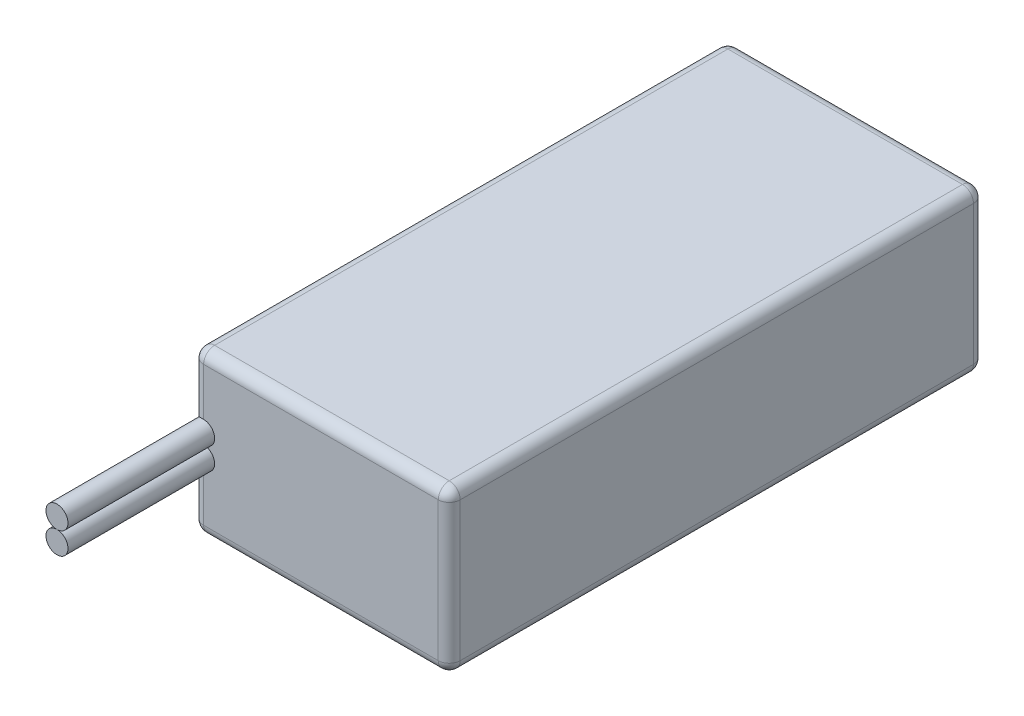
ISO-10303-21;
HEADER;
FILE_DESCRIPTION(('STEP AP214'),'2;1');
FILE_NAME('part.step','',(''),(''),'','','');
FILE_SCHEMA(('AUTOMOTIVE_DESIGN { 1 0 10303 214 1 1 1 1 }'));
ENDSEC;
DATA;
#1=APPLICATION_CONTEXT('core data for automotive mechanical design processes');
#2=APPLICATION_PROTOCOL_DEFINITION('international standard','automotive_design',2000,#1);
#3=PRODUCT_CONTEXT('',#1,'mechanical');
#4=PRODUCT('Part','Part','',(#3));
#5=PRODUCT_RELATED_PRODUCT_CATEGORY('part','',(#4));
#6=PRODUCT_DEFINITION_FORMATION('','',#4);
#7=PRODUCT_DEFINITION_CONTEXT('part definition',#1,'design');
#8=PRODUCT_DEFINITION('design','',#6,#7);
#9=PRODUCT_DEFINITION_SHAPE('','',#8);
#10=(LENGTH_UNIT() NAMED_UNIT(*) SI_UNIT(.MILLI.,.METRE.));
#11=(NAMED_UNIT(*) PLANE_ANGLE_UNIT() SI_UNIT($,.RADIAN.));
#12=(NAMED_UNIT(*) SI_UNIT($,.STERADIAN.) SOLID_ANGLE_UNIT());
#13=UNCERTAINTY_MEASURE_WITH_UNIT(LENGTH_MEASURE(1.E-05),#10,'distance_accuracy_value','');
#14=(GEOMETRIC_REPRESENTATION_CONTEXT(3) GLOBAL_UNCERTAINTY_ASSIGNED_CONTEXT((#13)) GLOBAL_UNIT_ASSIGNED_CONTEXT((#10,
#11,#12)) REPRESENTATION_CONTEXT('',''));
#15=CARTESIAN_POINT('',(0.,0.,0.));
#16=DIRECTION('',(0.,0.,1.));
#17=DIRECTION('',(1.,0.,0.));
#18=AXIS2_PLACEMENT_3D('',#15,#16,#17);
#19=CARTESIAN_POINT('',(-16.,9.5,31.5));
#20=DIRECTION('',(0.,0.,1.));
#21=DIRECTION('',(1.,0.,0.));
#22=AXIS2_PLACEMENT_3D('',#19,#20,#21);
#23=CYLINDRICAL_SURFACE('',#22,1.5);
#24=CARTESIAN_POINT('',(-16.,9.5,31.5));
#25=DIRECTION('',(0.,0.,1.));
#26=DIRECTION('',(1.,0.,0.));
#27=AXIS2_PLACEMENT_3D('',#24,#25,#26);
#28=CIRCLE('',#27,1.5);
#29=CARTESIAN_POINT('',(-14.5,9.5,31.5));
#30=VERTEX_POINT('',#29);
#31=EDGE_CURVE('E12',#30,#30,#28,.F.);
#32=ORIENTED_EDGE('',*,*,#31,.F.);
#33=EDGE_LOOP('',(#32));
#34=FACE_BOUND('',#33,.T.);
#35=CARTESIAN_POINT('',(-16.,9.5,56.5));
#36=DIRECTION('',(0.,0.,1.));
#37=DIRECTION('',(1.,0.,0.));
#38=AXIS2_PLACEMENT_3D('',#35,#36,#37);
#39=CIRCLE('',#38,1.5);
#40=CARTESIAN_POINT('',(-14.5,9.5,56.5));
#41=VERTEX_POINT('',#40);
#42=EDGE_CURVE('E72',#41,#41,#39,.F.);
#43=ORIENTED_EDGE('',*,*,#42,.T.);
#44=EDGE_LOOP('',(#43));
#45=FACE_BOUND('',#44,.T.);
#46=ADVANCED_FACE('F66',(#34,#45),#23,.T.);
#47=CARTESIAN_POINT('',(0.,0.,31.5));
#48=DIRECTION('',(0.,0.,1.));
#49=DIRECTION('',(1.,0.,0.));
#50=AXIS2_PLACEMENT_3D('',#47,#48,#49);
#51=PLANE('',#50);
#52=ORIENTED_EDGE('',*,*,#31,.T.);
#53=EDGE_LOOP('',(#52));
#54=FACE_BOUND('',#53,.T.);
#55=ADVANCED_FACE('F81',(#54),#51,.F.);
#56=CARTESIAN_POINT('',(0.,0.,56.5));
#57=DIRECTION('',(0.,0.,1.));
#58=DIRECTION('',(1.,0.,0.));
#59=AXIS2_PLACEMENT_3D('',#56,#57,#58);
#60=PLANE('',#59);
#61=ORIENTED_EDGE('',*,*,#42,.F.);
#62=EDGE_LOOP('',(#61));
#63=FACE_BOUND('',#62,.T.);
#64=ADVANCED_FACE('F79',(#63),#60,.T.);
#65=CLOSED_SHELL('',(#46,#55,#64));
#66=MANIFOLD_SOLID_BREP('B2',#65);
#67=CARTESIAN_POINT('',(-16.,12.5,31.5));
#68=DIRECTION('',(0.,0.,1.));
#69=DIRECTION('',(1.,0.,0.));
#70=AXIS2_PLACEMENT_3D('',#67,#68,#69);
#71=CYLINDRICAL_SURFACE('',#70,1.5);
#72=CARTESIAN_POINT('',(-16.,12.5,31.5));
#73=DIRECTION('',(0.,0.,1.));
#74=DIRECTION('',(1.,0.,0.));
#75=AXIS2_PLACEMENT_3D('',#72,#73,#74);
#76=CIRCLE('',#75,1.5);
#77=CARTESIAN_POINT('',(-14.5,12.5,31.5));
#78=VERTEX_POINT('',#77);
#79=EDGE_CURVE('E65',#78,#78,#76,.T.);
#80=ORIENTED_EDGE('',*,*,#79,.T.);
#81=EDGE_LOOP('',(#80));
#82=FACE_BOUND('',#81,.T.);
#83=CARTESIAN_POINT('',(-16.,12.5,56.5));
#84=DIRECTION('',(0.,0.,1.));
#85=DIRECTION('',(1.,0.,0.));
#86=AXIS2_PLACEMENT_3D('',#83,#84,#85);
#87=CIRCLE('',#86,1.5);
#88=CARTESIAN_POINT('',(-14.5,12.5,56.5));
#89=VERTEX_POINT('',#88);
#90=EDGE_CURVE('E128',#89,#89,#87,.T.);
#91=ORIENTED_EDGE('',*,*,#90,.F.);
#92=EDGE_LOOP('',(#91));
#93=FACE_BOUND('',#92,.T.);
#94=ADVANCED_FACE('F122',(#82,#93),#71,.T.);
#95=CARTESIAN_POINT('',(0.,0.,31.5));
#96=DIRECTION('',(0.,0.,1.));
#97=DIRECTION('',(1.,0.,0.));
#98=AXIS2_PLACEMENT_3D('',#95,#96,#97);
#99=PLANE('',#98);
#100=ORIENTED_EDGE('',*,*,#79,.F.);
#101=EDGE_LOOP('',(#100));
#102=FACE_BOUND('',#101,.T.);
#103=ADVANCED_FACE('F137',(#102),#99,.F.);
#104=CARTESIAN_POINT('',(0.,0.,56.5));
#105=DIRECTION('',(0.,0.,1.));
#106=DIRECTION('',(1.,0.,0.));
#107=AXIS2_PLACEMENT_3D('',#104,#105,#106);
#108=PLANE('',#107);
#109=ORIENTED_EDGE('',*,*,#90,.T.);
#110=EDGE_LOOP('',(#109));
#111=FACE_BOUND('',#110,.T.);
#112=ADVANCED_FACE('F134',(#111),#108,.T.);
#113=CLOSED_SHELL('',(#94,#103,#112));
#114=MANIFOLD_SOLID_BREP('B7',#113);
#115=CARTESIAN_POINT('',(17.5,22.,36.5));
#116=DIRECTION('',(-1.,0.,0.));
#117=DIRECTION('',(0.,0.,1.));
#118=AXIS2_PLACEMENT_3D('',#115,#116,#117);
#119=PLANE('',#118);
#120=DIRECTION('',(0.,-1.,0.));
#121=VECTOR('',#120,1.);
#122=CARTESIAN_POINT('',(17.5,22.,-35.));
#123=LINE('',#122,#121);
#124=CARTESIAN_POINT('',(17.5,1.5,-35.));
#125=VERTEX_POINT('',#124);
#126=CARTESIAN_POINT('',(17.5,20.5,-35.));
#127=VERTEX_POINT('',#126);
#128=EDGE_CURVE('E266',#125,#127,#123,.F.);
#129=ORIENTED_EDGE('',*,*,#128,.T.);
#130=DIRECTION('',(0.,0.,-1.));
#131=VECTOR('',#130,1.);
#132=CARTESIAN_POINT('',(17.5,20.5,36.5));
#133=LINE('',#132,#131);
#134=CARTESIAN_POINT('',(17.5,20.5,35.));
#135=VERTEX_POINT('',#134);
#136=EDGE_CURVE('E312',#127,#135,#133,.F.);
#137=ORIENTED_EDGE('',*,*,#136,.T.);
#138=DIRECTION('',(0.,-1.,0.));
#139=VECTOR('',#138,1.);
#140=CARTESIAN_POINT('',(17.5,22.,35.));
#141=LINE('',#140,#139);
#142=CARTESIAN_POINT('',(17.5,1.5,35.));
#143=VERTEX_POINT('',#142);
#144=EDGE_CURVE('E307',#135,#143,#141,.T.);
#145=ORIENTED_EDGE('',*,*,#144,.T.);
#146=DIRECTION('',(0.,0.,-1.));
#147=VECTOR('',#146,1.);
#148=CARTESIAN_POINT('',(17.5,1.5,-36.5));
#149=LINE('',#148,#147);
#150=EDGE_CURVE('E301',#143,#125,#149,.T.);
#151=ORIENTED_EDGE('',*,*,#150,.T.);
#152=EDGE_LOOP('',(#129,#137,#145,#151));
#153=FACE_BOUND('',#152,.T.);
#154=ADVANCED_FACE('F169',(#153),#119,.F.);
#155=CARTESIAN_POINT('',(-17.5,22.,-36.5));
#156=DIRECTION('',(0.,0.,1.));
#157=DIRECTION('',(1.,0.,0.));
#158=AXIS2_PLACEMENT_3D('',#155,#156,#157);
#159=PLANE('',#158);
#160=DIRECTION('',(0.,-1.,0.));
#161=VECTOR('',#160,1.);
#162=CARTESIAN_POINT('',(-16.,22.,-36.5));
#163=LINE('',#162,#161);
#164=CARTESIAN_POINT('',(-16.,1.5,-36.5));
#165=VERTEX_POINT('',#164);
#166=CARTESIAN_POINT('',(-16.,20.5,-36.5));
#167=VERTEX_POINT('',#166);
#168=EDGE_CURVE('E291',#165,#167,#163,.F.);
#169=ORIENTED_EDGE('',*,*,#168,.T.);
#170=DIRECTION('',(-1.,0.,0.));
#171=VECTOR('',#170,1.);
#172=CARTESIAN_POINT('',(-17.5,20.5,-36.5));
#173=LINE('',#172,#171);
#174=CARTESIAN_POINT('',(16.,20.5,-36.5));
#175=VERTEX_POINT('',#174);
#176=EDGE_CURVE('E295',#167,#175,#173,.F.);
#177=ORIENTED_EDGE('',*,*,#176,.T.);
#178=DIRECTION('',(0.,-1.,0.));
#179=VECTOR('',#178,1.);
#180=CARTESIAN_POINT('',(16.,22.,-36.5));
#181=LINE('',#180,#179);
#182=CARTESIAN_POINT('',(16.,1.5,-36.5));
#183=VERTEX_POINT('',#182);
#184=EDGE_CURVE('E264',#175,#183,#181,.T.);
#185=ORIENTED_EDGE('',*,*,#184,.T.);
#186=DIRECTION('',(-1.,0.,0.));
#187=VECTOR('',#186,1.);
#188=CARTESIAN_POINT('',(-17.5,1.5,-36.5));
#189=LINE('',#188,#187);
#190=EDGE_CURVE('E284',#183,#165,#189,.T.);
#191=ORIENTED_EDGE('',*,*,#190,.T.);
#192=EDGE_LOOP('',(#169,#177,#185,#191));
#193=FACE_BOUND('',#192,.T.);
#194=ADVANCED_FACE('F293',(#193),#159,.F.);
#195=CARTESIAN_POINT('',(-17.5,22.,36.5));
#196=DIRECTION('',(1.,0.,0.));
#197=DIRECTION('',(0.,0.,-1.));
#198=AXIS2_PLACEMENT_3D('',#195,#196,#197);
#199=PLANE('',#198);
#200=DIRECTION('',(0.,-1.,0.));
#201=VECTOR('',#200,1.);
#202=CARTESIAN_POINT('',(-17.5,22.,35.));
#203=LINE('',#202,#201);
#204=CARTESIAN_POINT('',(-17.5,1.5,35.));
#205=VERTEX_POINT('',#204);
#206=CARTESIAN_POINT('',(-17.5,20.5,35.));
#207=VERTEX_POINT('',#206);
#208=EDGE_CURVE('E318',#205,#207,#203,.F.);
#209=ORIENTED_EDGE('',*,*,#208,.T.);
#210=DIRECTION('',(0.,0.,1.));
#211=VECTOR('',#210,1.);
#212=CARTESIAN_POINT('',(-17.5,20.5,36.5));
#213=LINE('',#212,#211);
#214=CARTESIAN_POINT('',(-17.5,20.5,-35.));
#215=VERTEX_POINT('',#214);
#216=EDGE_CURVE('E325',#207,#215,#213,.F.);
#217=ORIENTED_EDGE('',*,*,#216,.T.);
#218=DIRECTION('',(0.,-1.,0.));
#219=VECTOR('',#218,1.);
#220=CARTESIAN_POINT('',(-17.5,22.,-35.));
#221=LINE('',#220,#219);
#222=CARTESIAN_POINT('',(-17.5,1.5,-35.));
#223=VERTEX_POINT('',#222);
#224=EDGE_CURVE('E321',#215,#223,#221,.T.);
#225=ORIENTED_EDGE('',*,*,#224,.T.);
#226=DIRECTION('',(0.,0.,1.));
#227=VECTOR('',#226,1.);
#228=CARTESIAN_POINT('',(-17.5,1.5,36.5));
#229=LINE('',#228,#227);
#230=EDGE_CURVE('E315',#223,#205,#229,.T.);
#231=ORIENTED_EDGE('',*,*,#230,.T.);
#232=EDGE_LOOP('',(#209,#217,#225,#231));
#233=FACE_BOUND('',#232,.T.);
#234=ADVANCED_FACE('F464',(#233),#199,.F.);
#235=CARTESIAN_POINT('',(-17.5,22.,36.5));
#236=DIRECTION('',(0.,0.,-1.));
#237=DIRECTION('',(-1.,0.,0.));
#238=AXIS2_PLACEMENT_3D('',#235,#236,#237);
#239=PLANE('',#238);
#240=DIRECTION('',(0.,-1.,0.));
#241=VECTOR('',#240,1.);
#242=CARTESIAN_POINT('',(16.,22.,36.5));
#243=LINE('',#242,#241);
#244=CARTESIAN_POINT('',(16.,1.5,36.5));
#245=VERTEX_POINT('',#244);
#246=CARTESIAN_POINT('',(16.,20.5,36.5));
#247=VERTEX_POINT('',#246);
#248=EDGE_CURVE('E331',#245,#247,#243,.F.);
#249=ORIENTED_EDGE('',*,*,#248,.T.);
#250=DIRECTION('',(1.,0.,0.));
#251=VECTOR('',#250,1.);
#252=CARTESIAN_POINT('',(-17.5,20.5,36.5));
#253=LINE('',#252,#251);
#254=CARTESIAN_POINT('',(-16.,20.5,36.5));
#255=VERTEX_POINT('',#254);
#256=EDGE_CURVE('E338',#247,#255,#253,.F.);
#257=ORIENTED_EDGE('',*,*,#256,.T.);
#258=DIRECTION('',(0.,-1.,0.));
#259=VECTOR('',#258,1.);
#260=CARTESIAN_POINT('',(-16.,22.,36.5));
#261=LINE('',#260,#259);
#262=CARTESIAN_POINT('',(-16.,1.5,36.5));
#263=VERTEX_POINT('',#262);
#264=EDGE_CURVE('E334',#255,#263,#261,.T.);
#265=ORIENTED_EDGE('',*,*,#264,.T.);
#266=DIRECTION('',(1.,0.,0.));
#267=VECTOR('',#266,1.);
#268=CARTESIAN_POINT('',(17.5,1.5,36.5));
#269=LINE('',#268,#267);
#270=EDGE_CURVE('E328',#263,#245,#269,.T.);
#271=ORIENTED_EDGE('',*,*,#270,.T.);
#272=EDGE_LOOP('',(#249,#257,#265,#271));
#273=FACE_BOUND('',#272,.T.);
#274=ADVANCED_FACE('F475',(#273),#239,.F.);
#275=CARTESIAN_POINT('',(0.,22.,0.));
#276=DIRECTION('',(0.,-1.,0.));
#277=DIRECTION('',(0.,0.,-1.));
#278=AXIS2_PLACEMENT_3D('',#275,#276,#277);
#279=PLANE('',#278);
#280=DIRECTION('',(0.,0.,1.));
#281=VECTOR('',#280,1.);
#282=CARTESIAN_POINT('',(-16.,22.,0.));
#283=LINE('',#282,#281);
#284=CARTESIAN_POINT('',(-16.,22.,-35.));
#285=VERTEX_POINT('',#284);
#286=CARTESIAN_POINT('',(-16.,22.,35.));
#287=VERTEX_POINT('',#286);
#288=EDGE_CURVE('E347',#285,#287,#283,.T.);
#289=ORIENTED_EDGE('',*,*,#288,.T.);
#290=DIRECTION('',(1.,0.,0.));
#291=VECTOR('',#290,1.);
#292=CARTESIAN_POINT('',(0.,22.,35.));
#293=LINE('',#292,#291);
#294=CARTESIAN_POINT('',(16.,22.,35.));
#295=VERTEX_POINT('',#294);
#296=EDGE_CURVE('E350',#287,#295,#293,.T.);
#297=ORIENTED_EDGE('',*,*,#296,.T.);
#298=DIRECTION('',(0.,0.,-1.));
#299=VECTOR('',#298,1.);
#300=CARTESIAN_POINT('',(16.,22.,0.));
#301=LINE('',#300,#299);
#302=CARTESIAN_POINT('',(16.,22.,-35.));
#303=VERTEX_POINT('',#302);
#304=EDGE_CURVE('E341',#295,#303,#301,.T.);
#305=ORIENTED_EDGE('',*,*,#304,.T.);
#306=DIRECTION('',(-1.,0.,0.));
#307=VECTOR('',#306,1.);
#308=CARTESIAN_POINT('',(0.,22.,-35.));
#309=LINE('',#308,#307);
#310=EDGE_CURVE('E344',#303,#285,#309,.T.);
#311=ORIENTED_EDGE('',*,*,#310,.T.);
#312=EDGE_LOOP('',(#289,#297,#305,#311));
#313=FACE_BOUND('',#312,.T.);
#314=ADVANCED_FACE('F456',(#313),#279,.F.);
#315=CARTESIAN_POINT('',(0.,0.,0.));
#316=DIRECTION('',(0.,-1.,0.));
#317=DIRECTION('',(0.,0.,-1.));
#318=AXIS2_PLACEMENT_3D('',#315,#316,#317);
#319=PLANE('',#318);
#320=DIRECTION('',(0.,0.,1.));
#321=VECTOR('',#320,1.);
#322=CARTESIAN_POINT('',(-16.,0.,-36.5));
#323=LINE('',#322,#321);
#324=CARTESIAN_POINT('',(-16.,0.,35.));
#325=VERTEX_POINT('',#324);
#326=CARTESIAN_POINT('',(-16.,0.,-35.));
#327=VERTEX_POINT('',#326);
#328=EDGE_CURVE('E179',#325,#327,#323,.F.);
#329=ORIENTED_EDGE('',*,*,#328,.T.);
#330=DIRECTION('',(-1.,0.,0.));
#331=VECTOR('',#330,1.);
#332=CARTESIAN_POINT('',(17.5,0.,-35.));
#333=LINE('',#332,#331);
#334=CARTESIAN_POINT('',(16.,0.,-35.));
#335=VERTEX_POINT('',#334);
#336=EDGE_CURVE('E120',#327,#335,#333,.F.);
#337=ORIENTED_EDGE('',*,*,#336,.T.);
#338=DIRECTION('',(0.,0.,-1.));
#339=VECTOR('',#338,1.);
#340=CARTESIAN_POINT('',(16.,0.,36.5));
#341=LINE('',#340,#339);
#342=CARTESIAN_POINT('',(16.,0.,35.));
#343=VERTEX_POINT('',#342);
#344=EDGE_CURVE('E354',#335,#343,#341,.F.);
#345=ORIENTED_EDGE('',*,*,#344,.T.);
#346=DIRECTION('',(1.,0.,0.));
#347=VECTOR('',#346,1.);
#348=CARTESIAN_POINT('',(-17.5,0.,35.));
#349=LINE('',#348,#347);
#350=EDGE_CURVE('E190',#343,#325,#349,.F.);
#351=ORIENTED_EDGE('',*,*,#350,.T.);
#352=EDGE_LOOP('',(#329,#337,#345,#351));
#353=FACE_BOUND('',#352,.T.);
#354=ADVANCED_FACE('F661',(#353),#319,.T.);
#355=CARTESIAN_POINT('',(-16.,22.,35.));
#356=DIRECTION('',(0.,-1.,0.));
#357=DIRECTION('',(0.,0.,-1.));
#358=AXIS2_PLACEMENT_3D('',#355,#356,#357);
#359=CYLINDRICAL_SURFACE('',#358,1.5);
#360=CARTESIAN_POINT('',(-16.,20.5,35.));
#361=DIRECTION('',(0.,1.,0.));
#362=DIRECTION('',(0.,0.,1.));
#363=AXIS2_PLACEMENT_3D('',#360,#361,#362);
#364=CIRCLE('',#363,1.5);
#365=EDGE_CURVE('E173',#207,#255,#364,.T.);
#366=ORIENTED_EDGE('',*,*,#365,.F.);
#367=ORIENTED_EDGE('',*,*,#208,.F.);
#368=CARTESIAN_POINT('',(-16.,1.5,35.));
#369=DIRECTION('',(0.,-1.,0.));
#370=DIRECTION('',(0.,0.,-1.));
#371=AXIS2_PLACEMENT_3D('',#368,#369,#370);
#372=CIRCLE('',#371,1.5);
#373=EDGE_CURVE('E431',#263,#205,#372,.T.);
#374=ORIENTED_EDGE('',*,*,#373,.F.);
#375=ORIENTED_EDGE('',*,*,#264,.F.);
#376=EDGE_LOOP('',(#366,#367,#374,#375));
#377=FACE_BOUND('',#376,.T.);
#378=ADVANCED_FACE('F171',(#377),#359,.T.);
#379=CARTESIAN_POINT('',(-16.,20.5,35.));
#380=DIRECTION('',(0.,0.,1.));
#381=DIRECTION('',(1.,0.,0.));
#382=AXIS2_PLACEMENT_3D('',#379,#380,#381);
#383=SPHERICAL_SURFACE('',#382,1.5);
#384=CARTESIAN_POINT('',(-16.,20.5,35.));
#385=DIRECTION('',(0.,0.,1.));
#386=DIRECTION('',(1.,0.,0.));
#387=AXIS2_PLACEMENT_3D('',#384,#385,#386);
#388=CIRCLE('',#387,1.5);
#389=EDGE_CURVE('E424',#207,#287,#388,.F.);
#390=ORIENTED_EDGE('',*,*,#389,.F.);
#391=ORIENTED_EDGE('',*,*,#365,.T.);
#392=CARTESIAN_POINT('',(-16.,20.5,35.));
#393=DIRECTION('',(-1.,0.,0.));
#394=DIRECTION('',(0.,0.,1.));
#395=AXIS2_PLACEMENT_3D('',#392,#393,#394);
#396=CIRCLE('',#395,1.5);
#397=EDGE_CURVE('E428',#287,#255,#396,.F.);
#398=ORIENTED_EDGE('',*,*,#397,.F.);
#399=EDGE_LOOP('',(#390,#391,#398));
#400=FACE_BOUND('',#399,.T.);
#401=ADVANCED_FACE('F444',(#400),#383,.T.);
#402=CARTESIAN_POINT('',(-16.,1.5,35.));
#403=DIRECTION('',(-1.,0.,0.));
#404=DIRECTION('',(0.,-1.,0.));
#405=AXIS2_PLACEMENT_3D('',#402,#403,#404);
#406=SPHERICAL_SURFACE('',#405,1.5);
#407=CARTESIAN_POINT('',(-16.,1.5,35.));
#408=DIRECTION('',(-1.,0.,0.));
#409=DIRECTION('',(0.,0.,1.));
#410=AXIS2_PLACEMENT_3D('',#407,#408,#409);
#411=CIRCLE('',#410,1.5);
#412=EDGE_CURVE('E417',#263,#325,#411,.F.);
#413=ORIENTED_EDGE('',*,*,#412,.F.);
#414=ORIENTED_EDGE('',*,*,#373,.T.);
#415=CARTESIAN_POINT('',(-16.,1.5,35.));
#416=DIRECTION('',(0.,0.,1.));
#417=DIRECTION('',(1.,0.,0.));
#418=AXIS2_PLACEMENT_3D('',#415,#416,#417);
#419=CIRCLE('',#418,1.5);
#420=EDGE_CURVE('E420',#325,#205,#419,.F.);
#421=ORIENTED_EDGE('',*,*,#420,.F.);
#422=EDGE_LOOP('',(#413,#414,#421));
#423=FACE_BOUND('',#422,.T.);
#424=ADVANCED_FACE('F640',(#423),#406,.T.);
#425=CARTESIAN_POINT('',(0.,20.5,35.));
#426=DIRECTION('',(1.,0.,0.));
#427=DIRECTION('',(0.,0.,-1.));
#428=AXIS2_PLACEMENT_3D('',#425,#426,#427);
#429=CYLINDRICAL_SURFACE('',#428,1.5);
#430=ORIENTED_EDGE('',*,*,#397,.T.);
#431=ORIENTED_EDGE('',*,*,#256,.F.);
#432=CARTESIAN_POINT('',(16.,20.5,35.));
#433=DIRECTION('',(1.,0.,0.));
#434=DIRECTION('',(0.,0.,-1.));
#435=AXIS2_PLACEMENT_3D('',#432,#433,#434);
#436=CIRCLE('',#435,1.5);
#437=EDGE_CURVE('E409',#295,#247,#436,.T.);
#438=ORIENTED_EDGE('',*,*,#437,.F.);
#439=ORIENTED_EDGE('',*,*,#296,.F.);
#440=EDGE_LOOP('',(#430,#431,#438,#439));
#441=FACE_BOUND('',#440,.T.);
#442=ADVANCED_FACE('F452',(#441),#429,.T.);
#443=CARTESIAN_POINT('',(-16.,20.5,0.));
#444=DIRECTION('',(0.,0.,1.));
#445=DIRECTION('',(1.,0.,0.));
#446=AXIS2_PLACEMENT_3D('',#443,#444,#445);
#447=CYLINDRICAL_SURFACE('',#446,1.5);
#448=ORIENTED_EDGE('',*,*,#389,.T.);
#449=ORIENTED_EDGE('',*,*,#288,.F.);
#450=CARTESIAN_POINT('',(-16.,20.5,-35.));
#451=DIRECTION('',(0.,0.,-1.));
#452=DIRECTION('',(-1.,0.,0.));
#453=AXIS2_PLACEMENT_3D('',#450,#451,#452);
#454=CIRCLE('',#453,1.5);
#455=EDGE_CURVE('E405',#215,#285,#454,.T.);
#456=ORIENTED_EDGE('',*,*,#455,.F.);
#457=ORIENTED_EDGE('',*,*,#216,.F.);
#458=EDGE_LOOP('',(#448,#449,#456,#457));
#459=FACE_BOUND('',#458,.T.);
#460=ADVANCED_FACE('F461',(#459),#447,.T.);
#461=CARTESIAN_POINT('',(-16.,22.,-35.));
#462=DIRECTION('',(0.,-1.,0.));
#463=DIRECTION('',(0.,0.,-1.));
#464=AXIS2_PLACEMENT_3D('',#461,#462,#463);
#465=CYLINDRICAL_SURFACE('',#464,1.5);
#466=CARTESIAN_POINT('',(-16.,1.5,-35.));
#467=DIRECTION('',(0.,-1.,0.));
#468=DIRECTION('',(0.,0.,-1.));
#469=AXIS2_PLACEMENT_3D('',#466,#467,#468);
#470=CIRCLE('',#469,1.5);
#471=EDGE_CURVE('E397',#223,#165,#470,.T.);
#472=ORIENTED_EDGE('',*,*,#471,.F.);
#473=ORIENTED_EDGE('',*,*,#224,.F.);
#474=CARTESIAN_POINT('',(-16.,20.5,-35.));
#475=DIRECTION('',(0.,1.,0.));
#476=DIRECTION('',(0.,0.,1.));
#477=AXIS2_PLACEMENT_3D('',#474,#475,#476);
#478=CIRCLE('',#477,1.5);
#479=EDGE_CURVE('E401',#167,#215,#478,.T.);
#480=ORIENTED_EDGE('',*,*,#479,.F.);
#481=ORIENTED_EDGE('',*,*,#168,.F.);
#482=EDGE_LOOP('',(#472,#473,#480,#481));
#483=FACE_BOUND('',#482,.T.);
#484=ADVANCED_FACE('F468',(#483),#465,.T.);
#485=CARTESIAN_POINT('',(-16.,1.5,36.5));
#486=DIRECTION('',(0.,0.,-1.));
#487=DIRECTION('',(-1.,0.,0.));
#488=AXIS2_PLACEMENT_3D('',#485,#486,#487);
#489=CYLINDRICAL_SURFACE('',#488,1.5);
#490=ORIENTED_EDGE('',*,*,#420,.T.);
#491=ORIENTED_EDGE('',*,*,#230,.F.);
#492=CARTESIAN_POINT('',(-16.,1.5,-35.));
#493=DIRECTION('',(0.,0.,-1.));
#494=DIRECTION('',(-1.,0.,0.));
#495=AXIS2_PLACEMENT_3D('',#492,#493,#494);
#496=CIRCLE('',#495,1.5);
#497=EDGE_CURVE('E394',#327,#223,#496,.T.);
#498=ORIENTED_EDGE('',*,*,#497,.F.);
#499=ORIENTED_EDGE('',*,*,#328,.F.);
#500=EDGE_LOOP('',(#490,#491,#498,#499));
#501=FACE_BOUND('',#500,.T.);
#502=ADVANCED_FACE('F473',(#501),#489,.T.);
#503=CARTESIAN_POINT('',(-17.5,1.5,35.));
#504=DIRECTION('',(-1.,0.,0.));
#505=DIRECTION('',(0.,0.,1.));
#506=AXIS2_PLACEMENT_3D('',#503,#504,#505);
#507=CYLINDRICAL_SURFACE('',#506,1.5);
#508=ORIENTED_EDGE('',*,*,#412,.T.);
#509=ORIENTED_EDGE('',*,*,#350,.F.);
#510=CARTESIAN_POINT('',(16.,1.5,35.));
#511=DIRECTION('',(1.,0.,0.));
#512=DIRECTION('',(0.,0.,-1.));
#513=AXIS2_PLACEMENT_3D('',#510,#511,#512);
#514=CIRCLE('',#513,1.5);
#515=EDGE_CURVE('E390',#245,#343,#514,.T.);
#516=ORIENTED_EDGE('',*,*,#515,.F.);
#517=ORIENTED_EDGE('',*,*,#270,.F.);
#518=EDGE_LOOP('',(#508,#509,#516,#517));
#519=FACE_BOUND('',#518,.T.);
#520=ADVANCED_FACE('F484',(#519),#507,.T.);
#521=CARTESIAN_POINT('',(16.,22.,35.));
#522=DIRECTION('',(0.,-1.,0.));
#523=DIRECTION('',(0.,0.,-1.));
#524=AXIS2_PLACEMENT_3D('',#521,#522,#523);
#525=CYLINDRICAL_SURFACE('',#524,1.5);
#526=CARTESIAN_POINT('',(16.,20.5,35.));
#527=DIRECTION('',(0.,1.,0.));
#528=DIRECTION('',(0.,0.,1.));
#529=AXIS2_PLACEMENT_3D('',#526,#527,#528);
#530=CIRCLE('',#529,1.5);
#531=EDGE_CURVE('E413',#247,#135,#530,.T.);
#532=ORIENTED_EDGE('',*,*,#531,.F.);
#533=ORIENTED_EDGE('',*,*,#248,.F.);
#534=CARTESIAN_POINT('',(16.,1.5,35.));
#535=DIRECTION('',(0.,-1.,0.));
#536=DIRECTION('',(0.,0.,-1.));
#537=AXIS2_PLACEMENT_3D('',#534,#535,#536);
#538=CIRCLE('',#537,1.5);
#539=EDGE_CURVE('E386',#143,#245,#538,.T.);
#540=ORIENTED_EDGE('',*,*,#539,.F.);
#541=ORIENTED_EDGE('',*,*,#144,.F.);
#542=EDGE_LOOP('',(#532,#533,#540,#541));
#543=FACE_BOUND('',#542,.T.);
#544=ADVANCED_FACE('F480',(#543),#525,.T.);
#545=CARTESIAN_POINT('',(16.,20.5,35.));
#546=DIRECTION('',(0.,0.,1.));
#547=DIRECTION('',(1.,0.,0.));
#548=AXIS2_PLACEMENT_3D('',#545,#546,#547);
#549=SPHERICAL_SURFACE('',#548,1.5);
#550=ORIENTED_EDGE('',*,*,#437,.T.);
#551=ORIENTED_EDGE('',*,*,#531,.T.);
#552=CARTESIAN_POINT('',(16.,20.5,35.));
#553=DIRECTION('',(0.,0.,1.));
#554=DIRECTION('',(1.,0.,0.));
#555=AXIS2_PLACEMENT_3D('',#552,#553,#554);
#556=CIRCLE('',#555,1.5);
#557=EDGE_CURVE('E382',#295,#135,#556,.F.);
#558=ORIENTED_EDGE('',*,*,#557,.F.);
#559=EDGE_LOOP('',(#550,#551,#558));
#560=FACE_BOUND('',#559,.T.);
#561=ADVANCED_FACE('F494',(#560),#549,.T.);
#562=CARTESIAN_POINT('',(-16.,20.5,-35.));
#563=DIRECTION('',(-1.,0.,0.));
#564=DIRECTION('',(0.,0.,1.));
#565=AXIS2_PLACEMENT_3D('',#562,#563,#564);
#566=SPHERICAL_SURFACE('',#565,1.5);
#567=ORIENTED_EDGE('',*,*,#479,.T.);
#568=ORIENTED_EDGE('',*,*,#455,.T.);
#569=CARTESIAN_POINT('',(-16.,20.5,-35.));
#570=DIRECTION('',(-1.,0.,0.));
#571=DIRECTION('',(0.,0.,1.));
#572=AXIS2_PLACEMENT_3D('',#569,#570,#571);
#573=CIRCLE('',#572,1.5);
#574=EDGE_CURVE('E378',#167,#285,#573,.F.);
#575=ORIENTED_EDGE('',*,*,#574,.F.);
#576=EDGE_LOOP('',(#567,#568,#575));
#577=FACE_BOUND('',#576,.T.);
#578=ADVANCED_FACE('F504',(#577),#566,.T.);
#579=CARTESIAN_POINT('',(-16.,1.5,-35.));
#580=DIRECTION('',(-1.,0.,0.));
#581=DIRECTION('',(0.,-1.,0.));
#582=AXIS2_PLACEMENT_3D('',#579,#580,#581);
#583=SPHERICAL_SURFACE('',#582,1.5);
#584=ORIENTED_EDGE('',*,*,#497,.T.);
#585=ORIENTED_EDGE('',*,*,#471,.T.);
#586=CARTESIAN_POINT('',(-16.,1.5,-35.));
#587=DIRECTION('',(-1.,0.,0.));
#588=DIRECTION('',(0.,0.,1.));
#589=AXIS2_PLACEMENT_3D('',#586,#587,#588);
#590=CIRCLE('',#589,1.5);
#591=EDGE_CURVE('E287',#327,#165,#590,.F.);
#592=ORIENTED_EDGE('',*,*,#591,.F.);
#593=EDGE_LOOP('',(#584,#585,#592));
#594=FACE_BOUND('',#593,.T.);
#595=ADVANCED_FACE('F506',(#594),#583,.T.);
#596=CARTESIAN_POINT('',(16.,1.5,35.));
#597=DIRECTION('',(0.,0.,1.));
#598=DIRECTION('',(0.,-1.,0.));
#599=AXIS2_PLACEMENT_3D('',#596,#597,#598);
#600=SPHERICAL_SURFACE('',#599,1.5);
#601=ORIENTED_EDGE('',*,*,#539,.T.);
#602=ORIENTED_EDGE('',*,*,#515,.T.);
#603=CARTESIAN_POINT('',(16.,1.5,35.));
#604=DIRECTION('',(0.,0.,1.));
#605=DIRECTION('',(1.,0.,0.));
#606=AXIS2_PLACEMENT_3D('',#603,#604,#605);
#607=CIRCLE('',#606,1.5);
#608=EDGE_CURVE('E372',#143,#343,#607,.F.);
#609=ORIENTED_EDGE('',*,*,#608,.F.);
#610=EDGE_LOOP('',(#601,#602,#609));
#611=FACE_BOUND('',#610,.T.);
#612=ADVANCED_FACE('F486',(#611),#600,.T.);
#613=CARTESIAN_POINT('',(16.,20.5,0.));
#614=DIRECTION('',(0.,0.,-1.));
#615=DIRECTION('',(-1.,0.,0.));
#616=AXIS2_PLACEMENT_3D('',#613,#614,#615);
#617=CYLINDRICAL_SURFACE('',#616,1.5);
#618=ORIENTED_EDGE('',*,*,#557,.T.);
#619=ORIENTED_EDGE('',*,*,#136,.F.);
#620=CARTESIAN_POINT('',(16.,20.5,-35.));
#621=DIRECTION('',(0.,0.,-1.));
#622=DIRECTION('',(-1.,0.,0.));
#623=AXIS2_PLACEMENT_3D('',#620,#621,#622);
#624=CIRCLE('',#623,1.5);
#625=EDGE_CURVE('E368',#303,#127,#624,.T.);
#626=ORIENTED_EDGE('',*,*,#625,.F.);
#627=ORIENTED_EDGE('',*,*,#304,.F.);
#628=EDGE_LOOP('',(#618,#619,#626,#627));
#629=FACE_BOUND('',#628,.T.);
#630=ADVANCED_FACE('F496',(#629),#617,.T.);
#631=CARTESIAN_POINT('',(0.,20.5,-35.));
#632=DIRECTION('',(-1.,0.,0.));
#633=DIRECTION('',(0.,0.,1.));
#634=AXIS2_PLACEMENT_3D('',#631,#632,#633);
#635=CYLINDRICAL_SURFACE('',#634,1.5);
#636=ORIENTED_EDGE('',*,*,#574,.T.);
#637=ORIENTED_EDGE('',*,*,#310,.F.);
#638=CARTESIAN_POINT('',(16.,20.5,-35.));
#639=DIRECTION('',(1.,0.,0.));
#640=DIRECTION('',(0.,0.,-1.));
#641=AXIS2_PLACEMENT_3D('',#638,#639,#640);
#642=CIRCLE('',#641,1.5);
#643=EDGE_CURVE('E281',#175,#303,#642,.T.);
#644=ORIENTED_EDGE('',*,*,#643,.F.);
#645=ORIENTED_EDGE('',*,*,#176,.F.);
#646=EDGE_LOOP('',(#636,#637,#644,#645));
#647=FACE_BOUND('',#646,.T.);
#648=ADVANCED_FACE('F502',(#647),#635,.T.);
#649=CARTESIAN_POINT('',(-17.5,1.5,-35.));
#650=DIRECTION('',(1.,0.,0.));
#651=DIRECTION('',(0.,0.,-1.));
#652=AXIS2_PLACEMENT_3D('',#649,#650,#651);
#653=CYLINDRICAL_SURFACE('',#652,1.5);
#654=ORIENTED_EDGE('',*,*,#591,.T.);
#655=ORIENTED_EDGE('',*,*,#190,.F.);
#656=CARTESIAN_POINT('',(16.,1.5,-35.));
#657=DIRECTION('',(1.,0.,0.));
#658=DIRECTION('',(0.,0.,-1.));
#659=AXIS2_PLACEMENT_3D('',#656,#657,#658);
#660=CIRCLE('',#659,1.5);
#661=EDGE_CURVE('E272',#335,#183,#660,.T.);
#662=ORIENTED_EDGE('',*,*,#661,.F.);
#663=ORIENTED_EDGE('',*,*,#336,.F.);
#664=EDGE_LOOP('',(#654,#655,#662,#663));
#665=FACE_BOUND('',#664,.T.);
#666=ADVANCED_FACE('F285',(#665),#653,.T.);
#667=CARTESIAN_POINT('',(16.,1.5,36.5));
#668=DIRECTION('',(0.,0.,1.));
#669=DIRECTION('',(1.,0.,0.));
#670=AXIS2_PLACEMENT_3D('',#667,#668,#669);
#671=CYLINDRICAL_SURFACE('',#670,1.5);
#672=ORIENTED_EDGE('',*,*,#608,.T.);
#673=ORIENTED_EDGE('',*,*,#344,.F.);
#674=CARTESIAN_POINT('',(16.,1.5,-35.));
#675=DIRECTION('',(0.,0.,-1.));
#676=DIRECTION('',(-1.,0.,0.));
#677=AXIS2_PLACEMENT_3D('',#674,#675,#676);
#678=CIRCLE('',#677,1.5);
#679=EDGE_CURVE('E276',#125,#335,#678,.T.);
#680=ORIENTED_EDGE('',*,*,#679,.F.);
#681=ORIENTED_EDGE('',*,*,#150,.F.);
#682=EDGE_LOOP('',(#672,#673,#680,#681));
#683=FACE_BOUND('',#682,.T.);
#684=ADVANCED_FACE('F489',(#683),#671,.T.);
#685=CARTESIAN_POINT('',(16.,20.5,-35.));
#686=DIRECTION('',(0.,1.,0.));
#687=DIRECTION('',(0.,0.,1.));
#688=AXIS2_PLACEMENT_3D('',#685,#686,#687);
#689=SPHERICAL_SURFACE('',#688,1.5);
#690=ORIENTED_EDGE('',*,*,#643,.T.);
#691=ORIENTED_EDGE('',*,*,#625,.T.);
#692=CARTESIAN_POINT('',(16.,20.5,-35.));
#693=DIRECTION('',(0.,1.,0.));
#694=DIRECTION('',(0.,0.,1.));
#695=AXIS2_PLACEMENT_3D('',#692,#693,#694);
#696=CIRCLE('',#695,1.5);
#697=EDGE_CURVE('E269',#175,#127,#696,.F.);
#698=ORIENTED_EDGE('',*,*,#697,.F.);
#699=EDGE_LOOP('',(#690,#691,#698));
#700=FACE_BOUND('',#699,.T.);
#701=ADVANCED_FACE('F500',(#700),#689,.T.);
#702=CARTESIAN_POINT('',(16.,1.5,-35.));
#703=DIRECTION('',(0.,-1.,0.));
#704=DIRECTION('',(0.,0.,-1.));
#705=AXIS2_PLACEMENT_3D('',#702,#703,#704);
#706=SPHERICAL_SURFACE('',#705,1.5);
#707=ORIENTED_EDGE('',*,*,#679,.T.);
#708=ORIENTED_EDGE('',*,*,#661,.T.);
#709=CARTESIAN_POINT('',(16.,1.5,-35.));
#710=DIRECTION('',(0.,-1.,0.));
#711=DIRECTION('',(0.,0.,-1.));
#712=AXIS2_PLACEMENT_3D('',#709,#710,#711);
#713=CIRCLE('',#712,1.5);
#714=EDGE_CURVE('E260',#125,#183,#713,.F.);
#715=ORIENTED_EDGE('',*,*,#714,.F.);
#716=EDGE_LOOP('',(#707,#708,#715));
#717=FACE_BOUND('',#716,.T.);
#718=ADVANCED_FACE('F274',(#717),#706,.T.);
#719=CARTESIAN_POINT('',(16.,22.,-35.));
#720=DIRECTION('',(0.,-1.,0.));
#721=DIRECTION('',(0.,0.,-1.));
#722=AXIS2_PLACEMENT_3D('',#719,#720,#721);
#723=CYLINDRICAL_SURFACE('',#722,1.5);
#724=ORIENTED_EDGE('',*,*,#697,.T.);
#725=ORIENTED_EDGE('',*,*,#128,.F.);
#726=ORIENTED_EDGE('',*,*,#714,.T.);
#727=ORIENTED_EDGE('',*,*,#184,.F.);
#728=EDGE_LOOP('',(#724,#725,#726,#727));
#729=FACE_BOUND('',#728,.T.);
#730=ADVANCED_FACE('F262',(#729),#723,.T.);
#731=CLOSED_SHELL('',(#154,#194,#234,#274,#314,#354,#378,#401,#424,#442,#460,#484,#502,#520,
#544,#561,#578,#595,#612,#630,#648,#666,#684,#701,#718,#730));
#732=MANIFOLD_SOLID_BREP('B60',#731);
#733=ADVANCED_BREP_SHAPE_REPRESENTATION('',(#18,#66,#114,#732),#14);
#734=SHAPE_DEFINITION_REPRESENTATION(#9,#733);
ENDSEC;
END-ISO-10303-21;
